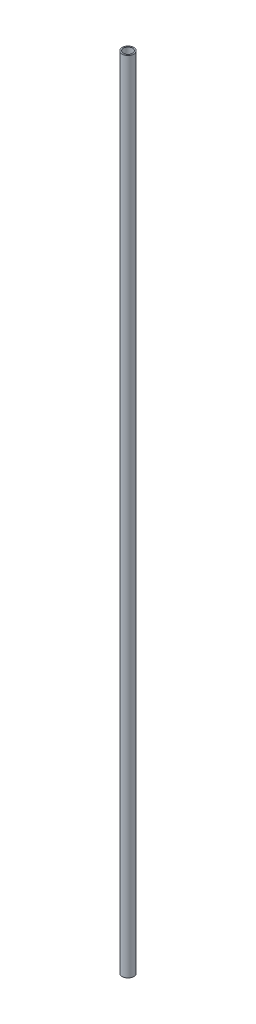
ISO-10303-21;
HEADER;
FILE_DESCRIPTION(('STEP AP214'),'2;1');
FILE_NAME('part.step','',(''),(''),'','','');
FILE_SCHEMA(('AUTOMOTIVE_DESIGN { 1 0 10303 214 1 1 1 1 }'));
ENDSEC;
DATA;
#1=APPLICATION_CONTEXT('core data for automotive mechanical design processes');
#2=APPLICATION_PROTOCOL_DEFINITION('international standard','automotive_design',2000,#1);
#3=PRODUCT_CONTEXT('',#1,'mechanical');
#4=PRODUCT('Part','Part','',(#3));
#5=PRODUCT_RELATED_PRODUCT_CATEGORY('part','',(#4));
#6=PRODUCT_DEFINITION_FORMATION('','',#4);
#7=PRODUCT_DEFINITION_CONTEXT('part definition',#1,'design');
#8=PRODUCT_DEFINITION('design','',#6,#7);
#9=PRODUCT_DEFINITION_SHAPE('','',#8);
#10=(LENGTH_UNIT() NAMED_UNIT(*) SI_UNIT(.MILLI.,.METRE.));
#11=(NAMED_UNIT(*) PLANE_ANGLE_UNIT() SI_UNIT($,.RADIAN.));
#12=(NAMED_UNIT(*) SI_UNIT($,.STERADIAN.) SOLID_ANGLE_UNIT());
#13=UNCERTAINTY_MEASURE_WITH_UNIT(LENGTH_MEASURE(1.E-05),#10,'distance_accuracy_value','');
#14=(GEOMETRIC_REPRESENTATION_CONTEXT(3) GLOBAL_UNCERTAINTY_ASSIGNED_CONTEXT((#13)) GLOBAL_UNIT_ASSIGNED_CONTEXT((#10,
#11,#12)) REPRESENTATION_CONTEXT('',''));
#15=CARTESIAN_POINT('',(0.,0.,0.));
#16=DIRECTION('',(0.,0.,1.));
#17=DIRECTION('',(1.,0.,0.));
#18=AXIS2_PLACEMENT_3D('',#15,#16,#17);
#19=CARTESIAN_POINT('',(0.,703.,0.));
#20=DIRECTION('',(0.,1.,0.));
#21=DIRECTION('',(0.,0.,1.));
#22=AXIS2_PLACEMENT_3D('',#19,#20,#21);
#23=PLANE('',#22);
#24=CARTESIAN_POINT('',(0.,703.,0.));
#25=DIRECTION('',(0.,1.,0.));
#26=DIRECTION('',(0.,0.,1.));
#27=AXIS2_PLACEMENT_3D('',#24,#25,#26);
#28=CIRCLE('',#27,5.1);
#29=CARTESIAN_POINT('',(0.,703.,5.1));
#30=VERTEX_POINT('',#29);
#31=EDGE_CURVE('E10',#30,#30,#28,.T.);
#32=ORIENTED_EDGE('',*,*,#31,.T.);
#33=EDGE_LOOP('',(#32));
#34=FACE_BOUND('',#33,.T.);
#35=CARTESIAN_POINT('',(0.,703.,0.));
#36=DIRECTION('',(0.,1.,0.));
#37=DIRECTION('',(0.,0.,1.));
#38=AXIS2_PLACEMENT_3D('',#35,#36,#37);
#39=CIRCLE('',#38,4.);
#40=CARTESIAN_POINT('',(0.,703.,4.));
#41=VERTEX_POINT('',#40);
#42=EDGE_CURVE('E44',#41,#41,#39,.T.);
#43=ORIENTED_EDGE('',*,*,#42,.F.);
#44=EDGE_LOOP('',(#43));
#45=FACE_BOUND('',#44,.T.);
#46=ADVANCED_FACE('F33',(#34,#45),#23,.T.);
#47=CARTESIAN_POINT('',(0.,0.,0.));
#48=DIRECTION('',(0.,1.,0.));
#49=DIRECTION('',(0.,0.,1.));
#50=AXIS2_PLACEMENT_3D('',#47,#48,#49);
#51=PLANE('',#50);
#52=CARTESIAN_POINT('',(0.,0.,0.));
#53=DIRECTION('',(0.,1.,0.));
#54=DIRECTION('',(0.,0.,1.));
#55=AXIS2_PLACEMENT_3D('',#52,#53,#54);
#56=CIRCLE('',#55,5.1);
#57=CARTESIAN_POINT('',(0.,0.,5.1));
#58=VERTEX_POINT('',#57);
#59=EDGE_CURVE('E37',#58,#58,#56,.T.);
#60=ORIENTED_EDGE('',*,*,#59,.F.);
#61=EDGE_LOOP('',(#60));
#62=FACE_BOUND('',#61,.T.);
#63=CARTESIAN_POINT('',(0.,0.,0.));
#64=DIRECTION('',(0.,1.,0.));
#65=DIRECTION('',(0.,0.,1.));
#66=AXIS2_PLACEMENT_3D('',#63,#64,#65);
#67=CIRCLE('',#66,4.);
#68=CARTESIAN_POINT('',(0.,0.,4.));
#69=VERTEX_POINT('',#68);
#70=EDGE_CURVE('E46',#69,#69,#67,.T.);
#71=ORIENTED_EDGE('',*,*,#70,.T.);
#72=EDGE_LOOP('',(#71));
#73=FACE_BOUND('',#72,.T.);
#74=ADVANCED_FACE('F56',(#62,#73),#51,.F.);
#75=CARTESIAN_POINT('',(0.,703.,0.));
#76=DIRECTION('',(0.,-1.,0.));
#77=DIRECTION('',(0.,0.,-1.));
#78=AXIS2_PLACEMENT_3D('',#75,#76,#77);
#79=CYLINDRICAL_SURFACE('',#78,5.1);
#80=ORIENTED_EDGE('',*,*,#31,.F.);
#81=EDGE_LOOP('',(#80));
#82=FACE_BOUND('',#81,.T.);
#83=ORIENTED_EDGE('',*,*,#59,.T.);
#84=EDGE_LOOP('',(#83));
#85=FACE_BOUND('',#84,.T.);
#86=ADVANCED_FACE('F35',(#82,#85),#79,.T.);
#87=CARTESIAN_POINT('',(0.,703.,0.));
#88=DIRECTION('',(0.,-1.,0.));
#89=DIRECTION('',(0.,0.,-1.));
#90=AXIS2_PLACEMENT_3D('',#87,#88,#89);
#91=CYLINDRICAL_SURFACE('',#90,4.);
#92=ORIENTED_EDGE('',*,*,#42,.T.);
#93=EDGE_LOOP('',(#92));
#94=FACE_BOUND('',#93,.T.);
#95=ORIENTED_EDGE('',*,*,#70,.F.);
#96=EDGE_LOOP('',(#95));
#97=FACE_BOUND('',#96,.T.);
#98=ADVANCED_FACE('F52',(#94,#97),#91,.F.);
#99=CLOSED_SHELL('',(#46,#74,#86,#98));
#100=MANIFOLD_SOLID_BREP('B2',#99);
#101=ADVANCED_BREP_SHAPE_REPRESENTATION('',(#18,#100),#14);
#102=SHAPE_DEFINITION_REPRESENTATION(#9,#101);
ENDSEC;
END-ISO-10303-21;
